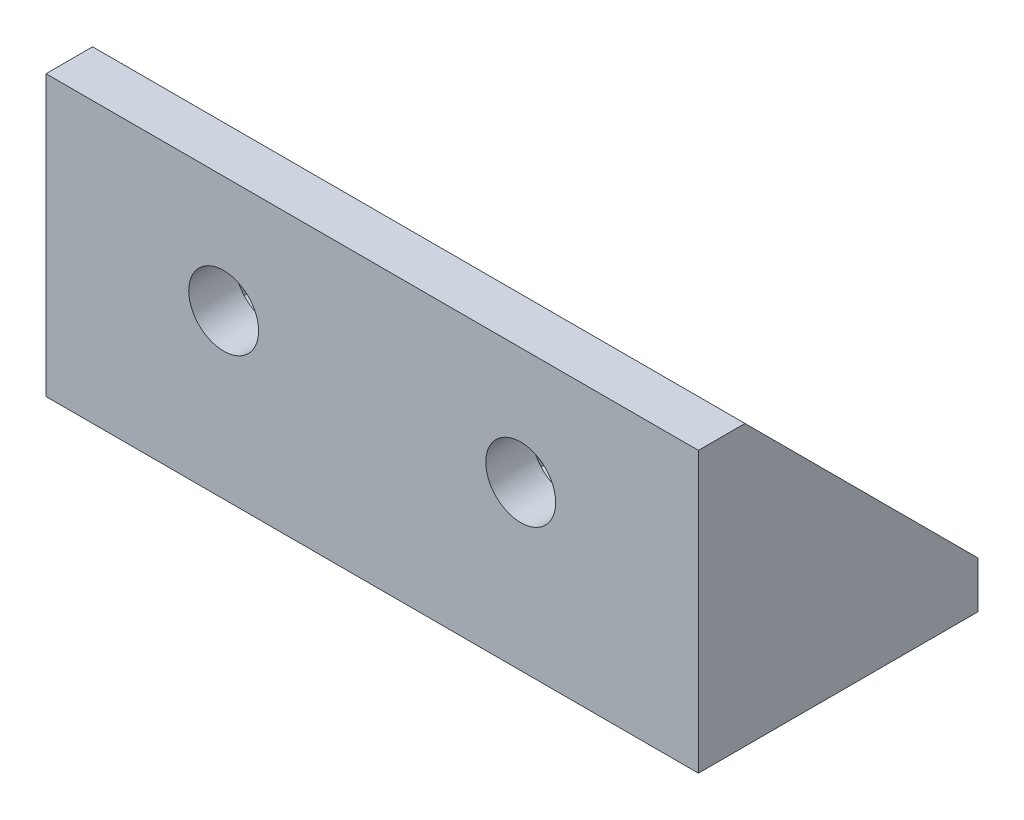
ISO-10303-21;
HEADER;
FILE_DESCRIPTION(('STEP AP214'),'2;1');
FILE_NAME('part.step','',(''),(''),'','','');
FILE_SCHEMA(('AUTOMOTIVE_DESIGN { 1 0 10303 214 1 1 1 1 }'));
ENDSEC;
DATA;
#1=APPLICATION_CONTEXT('core data for automotive mechanical design processes');
#2=APPLICATION_PROTOCOL_DEFINITION('international standard','automotive_design',2000,#1);
#3=PRODUCT_CONTEXT('',#1,'mechanical');
#4=PRODUCT('Part','Part','',(#3));
#5=PRODUCT_RELATED_PRODUCT_CATEGORY('part','',(#4));
#6=PRODUCT_DEFINITION_FORMATION('','',#4);
#7=PRODUCT_DEFINITION_CONTEXT('part definition',#1,'design');
#8=PRODUCT_DEFINITION('design','',#6,#7);
#9=PRODUCT_DEFINITION_SHAPE('','',#8);
#10=(LENGTH_UNIT() NAMED_UNIT(*) SI_UNIT(.MILLI.,.METRE.));
#11=(NAMED_UNIT(*) PLANE_ANGLE_UNIT() SI_UNIT($,.RADIAN.));
#12=(NAMED_UNIT(*) SI_UNIT($,.STERADIAN.) SOLID_ANGLE_UNIT());
#13=UNCERTAINTY_MEASURE_WITH_UNIT(LENGTH_MEASURE(1.E-05),#10,'distance_accuracy_value','');
#14=(GEOMETRIC_REPRESENTATION_CONTEXT(3) GLOBAL_UNCERTAINTY_ASSIGNED_CONTEXT((#13)) GLOBAL_UNIT_ASSIGNED_CONTEXT((#10,
#11,#12)) REPRESENTATION_CONTEXT('',''));
#15=CARTESIAN_POINT('',(0.,0.,0.));
#16=DIRECTION('',(0.,0.,1.));
#17=DIRECTION('',(1.,0.,0.));
#18=AXIS2_PLACEMENT_3D('',#15,#16,#17);
#19=CARTESIAN_POINT('',(53.,4.,-20.));
#20=DIRECTION('',(0.,0.707106781186548,-0.707106781186548));
#21=DIRECTION('',(0.,0.707106781186548,0.707106781186548));
#22=AXIS2_PLACEMENT_3D('',#19,#20,#21);
#23=PLANE('',#22);
#24=DIRECTION('',(0.,0.707106781186548,0.707106781186548));
#25=VECTOR('',#24,1.);
#26=CARTESIAN_POINT('',(27.5,4.,-20.));
#27=LINE('',#26,#25);
#28=CARTESIAN_POINT('',(27.5,4.,-20.));
#29=VERTEX_POINT('',#28);
#30=CARTESIAN_POINT('',(27.5,24.,0.));
#31=VERTEX_POINT('',#30);
#32=EDGE_CURVE('E11',#29,#31,#27,.T.);
#33=ORIENTED_EDGE('',*,*,#32,.F.);
#34=DIRECTION('',(-1.,0.,0.));
#35=VECTOR('',#34,1.);
#36=CARTESIAN_POINT('',(0.,4.,-20.));
#37=LINE('',#36,#35);
#38=CARTESIAN_POINT('',(22.5,4.,-20.));
#39=VERTEX_POINT('',#38);
#40=EDGE_CURVE('E304',#29,#39,#37,.T.);
#41=ORIENTED_EDGE('',*,*,#40,.T.);
#42=DIRECTION('',(0.,-0.707106781186548,-0.707106781186548));
#43=VECTOR('',#42,1.);
#44=CARTESIAN_POINT('',(22.5,4.,-20.));
#45=LINE('',#44,#43);
#46=CARTESIAN_POINT('',(22.5,24.,0.));
#47=VERTEX_POINT('',#46);
#48=EDGE_CURVE('E150',#47,#39,#45,.T.);
#49=ORIENTED_EDGE('',*,*,#48,.F.);
#50=DIRECTION('',(-1.,0.,0.));
#51=VECTOR('',#50,1.);
#52=CARTESIAN_POINT('',(0.,24.,0.));
#53=LINE('',#52,#51);
#54=EDGE_CURVE('E157',#31,#47,#53,.T.);
#55=ORIENTED_EDGE('',*,*,#54,.F.);
#56=EDGE_LOOP('',(#33,#41,#49,#55));
#57=FACE_BOUND('',#56,.T.);
#58=ADVANCED_FACE('F39',(#57),#23,.T.);
#59=DIRECTION('',(0.,-0.707106781186548,-0.707106781186548));
#60=VECTOR('',#59,1.);
#61=CARTESIAN_POINT('',(48.,4.,-20.));
#62=LINE('',#61,#60);
#63=CARTESIAN_POINT('',(48.,24.,0.));
#64=VERTEX_POINT('',#63);
#65=CARTESIAN_POINT('',(48.,4.,-20.));
#66=VERTEX_POINT('',#65);
#67=EDGE_CURVE('E48',#64,#66,#62,.T.);
#68=ORIENTED_EDGE('',*,*,#67,.F.);
#69=CARTESIAN_POINT('',(53.,24.,0.));
#70=VERTEX_POINT('',#69);
#71=EDGE_CURVE('E146',#70,#64,#53,.T.);
#72=ORIENTED_EDGE('',*,*,#71,.F.);
#73=DIRECTION('',(0.,-0.707106781186548,-0.707106781186548));
#74=VECTOR('',#73,1.);
#75=CARTESIAN_POINT('',(53.,4.,-20.));
#76=LINE('',#75,#74);
#77=CARTESIAN_POINT('',(53.,4.,-20.));
#78=VERTEX_POINT('',#77);
#79=EDGE_CURVE('E188',#70,#78,#76,.T.);
#80=ORIENTED_EDGE('',*,*,#79,.T.);
#81=EDGE_CURVE('E148',#78,#66,#37,.T.);
#82=ORIENTED_EDGE('',*,*,#81,.T.);
#83=EDGE_LOOP('',(#68,#72,#80,#82));
#84=FACE_BOUND('',#83,.T.);
#85=ADVANCED_FACE('F144',(#84),#23,.T.);
#86=DIRECTION('',(0.,0.707106781186548,0.707106781186548));
#87=VECTOR('',#86,1.);
#88=CARTESIAN_POINT('',(2.,4.,-20.));
#89=LINE('',#88,#87);
#90=CARTESIAN_POINT('',(2.,4.,-20.));
#91=VERTEX_POINT('',#90);
#92=CARTESIAN_POINT('',(2.,24.,0.));
#93=VERTEX_POINT('',#92);
#94=EDGE_CURVE('E294',#91,#93,#89,.T.);
#95=ORIENTED_EDGE('',*,*,#94,.F.);
#96=CARTESIAN_POINT('',(-3.,4.,-20.));
#97=VERTEX_POINT('',#96);
#98=EDGE_CURVE('E297',#91,#97,#37,.T.);
#99=ORIENTED_EDGE('',*,*,#98,.T.);
#100=DIRECTION('',(0.,-0.707106781186548,-0.707106781186548));
#101=VECTOR('',#100,1.);
#102=CARTESIAN_POINT('',(-3.,4.,-20.));
#103=LINE('',#102,#101);
#104=CARTESIAN_POINT('',(-3.,24.,0.));
#105=VERTEX_POINT('',#104);
#106=EDGE_CURVE('E206',#105,#97,#103,.T.);
#107=ORIENTED_EDGE('',*,*,#106,.F.);
#108=EDGE_CURVE('E159',#93,#105,#53,.T.);
#109=ORIENTED_EDGE('',*,*,#108,.F.);
#110=EDGE_LOOP('',(#95,#99,#107,#109));
#111=FACE_BOUND('',#110,.T.);
#112=ADVANCED_FACE('F295',(#111),#23,.T.);
#113=CARTESIAN_POINT('',(53.,0.,0.));
#114=DIRECTION('',(1.,0.,0.));
#115=DIRECTION('',(0.,0.,-1.));
#116=AXIS2_PLACEMENT_3D('',#113,#114,#115);
#117=PLANE('',#116);
#118=ORIENTED_EDGE('',*,*,#79,.F.);
#119=DIRECTION('',(0.,0.,-1.));
#120=VECTOR('',#119,1.);
#121=CARTESIAN_POINT('',(53.,24.,0.));
#122=LINE('',#121,#120);
#123=CARTESIAN_POINT('',(53.,24.,4.));
#124=VERTEX_POINT('',#123);
#125=EDGE_CURVE('E154',#124,#70,#122,.T.);
#126=ORIENTED_EDGE('',*,*,#125,.F.);
#127=DIRECTION('',(0.,1.,0.));
#128=VECTOR('',#127,1.);
#129=CARTESIAN_POINT('',(53.,24.,4.));
#130=LINE('',#129,#128);
#131=CARTESIAN_POINT('',(53.,0.,4.));
#132=VERTEX_POINT('',#131);
#133=EDGE_CURVE('E175',#132,#124,#130,.T.);
#134=ORIENTED_EDGE('',*,*,#133,.F.);
#135=DIRECTION('',(0.,0.,1.));
#136=VECTOR('',#135,1.);
#137=CARTESIAN_POINT('',(53.,0.,-20.));
#138=LINE('',#137,#136);
#139=CARTESIAN_POINT('',(53.,0.,-20.));
#140=VERTEX_POINT('',#139);
#141=EDGE_CURVE('E180',#140,#132,#138,.T.);
#142=ORIENTED_EDGE('',*,*,#141,.F.);
#143=DIRECTION('',(0.,-1.,0.));
#144=VECTOR('',#143,1.);
#145=CARTESIAN_POINT('',(53.,4.,-20.));
#146=LINE('',#145,#144);
#147=EDGE_CURVE('E184',#78,#140,#146,.T.);
#148=ORIENTED_EDGE('',*,*,#147,.F.);
#149=EDGE_LOOP('',(#118,#126,#134,#142,#148));
#150=FACE_BOUND('',#149,.T.);
#151=ADVANCED_FACE('F342',(#150),#117,.T.);
#152=CARTESIAN_POINT('',(-3.,0.,0.));
#153=DIRECTION('',(1.,0.,0.));
#154=DIRECTION('',(0.,0.,-1.));
#155=AXIS2_PLACEMENT_3D('',#152,#153,#154);
#156=PLANE('',#155);
#157=ORIENTED_EDGE('',*,*,#106,.T.);
#158=DIRECTION('',(0.,-1.,0.));
#159=VECTOR('',#158,1.);
#160=CARTESIAN_POINT('',(-3.,4.,-20.));
#161=LINE('',#160,#159);
#162=CARTESIAN_POINT('',(-3.,0.,-20.));
#163=VERTEX_POINT('',#162);
#164=EDGE_CURVE('E202',#97,#163,#161,.T.);
#165=ORIENTED_EDGE('',*,*,#164,.T.);
#166=DIRECTION('',(0.,0.,1.));
#167=VECTOR('',#166,1.);
#168=CARTESIAN_POINT('',(-3.,0.,-20.));
#169=LINE('',#168,#167);
#170=CARTESIAN_POINT('',(-3.,0.,4.));
#171=VERTEX_POINT('',#170);
#172=EDGE_CURVE('E198',#163,#171,#169,.T.);
#173=ORIENTED_EDGE('',*,*,#172,.T.);
#174=DIRECTION('',(0.,1.,0.));
#175=VECTOR('',#174,1.);
#176=CARTESIAN_POINT('',(-3.,24.,4.));
#177=LINE('',#176,#175);
#178=CARTESIAN_POINT('',(-3.,24.,4.));
#179=VERTEX_POINT('',#178);
#180=EDGE_CURVE('E194',#171,#179,#177,.T.);
#181=ORIENTED_EDGE('',*,*,#180,.T.);
#182=DIRECTION('',(0.,0.,-1.));
#183=VECTOR('',#182,1.);
#184=CARTESIAN_POINT('',(-3.,24.,0.));
#185=LINE('',#184,#183);
#186=EDGE_CURVE('E191',#179,#105,#185,.T.);
#187=ORIENTED_EDGE('',*,*,#186,.T.);
#188=EDGE_LOOP('',(#157,#165,#173,#181,#187));
#189=FACE_BOUND('',#188,.T.);
#190=ADVANCED_FACE('F346',(#189),#156,.F.);
#191=CARTESIAN_POINT('',(0.,0.,0.));
#192=DIRECTION('',(0.,1.,0.));
#193=DIRECTION('',(0.,0.,1.));
#194=AXIS2_PLACEMENT_3D('',#191,#192,#193);
#195=PLANE('',#194);
#196=CARTESIAN_POINT('',(12.25,0.,-10.));
#197=DIRECTION('',(0.,1.,0.));
#198=DIRECTION('',(0.,0.,1.));
#199=AXIS2_PLACEMENT_3D('',#196,#197,#198);
#200=CIRCLE('',#199,3.);
#201=CARTESIAN_POINT('',(12.25,0.,-7.));
#202=VERTEX_POINT('',#201);
#203=EDGE_CURVE('E258',#202,#202,#200,.T.);
#204=ORIENTED_EDGE('',*,*,#203,.T.);
#205=EDGE_LOOP('',(#204));
#206=FACE_BOUND('',#205,.T.);
#207=CARTESIAN_POINT('',(37.75,0.,-10.));
#208=DIRECTION('',(0.,1.,0.));
#209=DIRECTION('',(0.,0.,1.));
#210=AXIS2_PLACEMENT_3D('',#207,#208,#209);
#211=CIRCLE('',#210,3.);
#212=CARTESIAN_POINT('',(37.75,0.,-7.));
#213=VERTEX_POINT('',#212);
#214=EDGE_CURVE('E265',#213,#213,#211,.T.);
#215=ORIENTED_EDGE('',*,*,#214,.T.);
#216=EDGE_LOOP('',(#215));
#217=FACE_BOUND('',#216,.T.);
#218=DIRECTION('',(1.,0.,0.));
#219=VECTOR('',#218,1.);
#220=CARTESIAN_POINT('',(0.,0.,4.));
#221=LINE('',#220,#219);
#222=EDGE_CURVE('E156',#171,#132,#221,.T.);
#223=ORIENTED_EDGE('',*,*,#222,.F.);
#224=ORIENTED_EDGE('',*,*,#172,.F.);
#225=DIRECTION('',(-1.,0.,0.));
#226=VECTOR('',#225,1.);
#227=CARTESIAN_POINT('',(0.,0.,-20.));
#228=LINE('',#227,#226);
#229=EDGE_CURVE('E162',#140,#163,#228,.T.);
#230=ORIENTED_EDGE('',*,*,#229,.F.);
#231=ORIENTED_EDGE('',*,*,#141,.T.);
#232=EDGE_LOOP('',(#223,#224,#230,#231));
#233=FACE_BOUND('',#232,.T.);
#234=ADVANCED_FACE('F351',(#206,#217,#233),#195,.F.);
#235=CARTESIAN_POINT('',(0.,4.,4.));
#236=DIRECTION('',(0.,0.,-1.));
#237=DIRECTION('',(-1.,0.,0.));
#238=AXIS2_PLACEMENT_3D('',#235,#236,#237);
#239=PLANE('',#238);
#240=CARTESIAN_POINT('',(37.75,14.,4.));
#241=DIRECTION('',(0.,0.,-1.));
#242=DIRECTION('',(-1.,0.,0.));
#243=AXIS2_PLACEMENT_3D('',#240,#241,#242);
#244=CIRCLE('',#243,3.);
#245=CARTESIAN_POINT('',(34.75,14.,4.));
#246=VERTEX_POINT('',#245);
#247=EDGE_CURVE('E249',#246,#246,#244,.T.);
#248=ORIENTED_EDGE('',*,*,#247,.T.);
#249=EDGE_LOOP('',(#248));
#250=FACE_BOUND('',#249,.T.);
#251=CARTESIAN_POINT('',(12.25,14.,4.));
#252=DIRECTION('',(0.,0.,-1.));
#253=DIRECTION('',(-1.,0.,0.));
#254=AXIS2_PLACEMENT_3D('',#251,#252,#253);
#255=CIRCLE('',#254,3.);
#256=CARTESIAN_POINT('',(9.25,14.,4.));
#257=VERTEX_POINT('',#256);
#258=EDGE_CURVE('E224',#257,#257,#255,.T.);
#259=ORIENTED_EDGE('',*,*,#258,.T.);
#260=EDGE_LOOP('',(#259));
#261=FACE_BOUND('',#260,.T.);
#262=ORIENTED_EDGE('',*,*,#222,.T.);
#263=ORIENTED_EDGE('',*,*,#133,.T.);
#264=DIRECTION('',(1.,0.,0.));
#265=VECTOR('',#264,1.);
#266=CARTESIAN_POINT('',(0.,24.,4.));
#267=LINE('',#266,#265);
#268=EDGE_CURVE('E167',#179,#124,#267,.T.);
#269=ORIENTED_EDGE('',*,*,#268,.F.);
#270=ORIENTED_EDGE('',*,*,#180,.F.);
#271=EDGE_LOOP('',(#262,#263,#269,#270));
#272=FACE_BOUND('',#271,.T.);
#273=ADVANCED_FACE('F41',(#250,#261,#272),#239,.F.);
#274=CARTESIAN_POINT('',(0.,4.,-20.));
#275=DIRECTION('',(0.,0.,1.));
#276=DIRECTION('',(1.,0.,0.));
#277=AXIS2_PLACEMENT_3D('',#274,#275,#276);
#278=PLANE('',#277);
#279=ORIENTED_EDGE('',*,*,#229,.T.);
#280=ORIENTED_EDGE('',*,*,#164,.F.);
#281=ORIENTED_EDGE('',*,*,#98,.F.);
#282=DIRECTION('',(-1.,0.,0.));
#283=VECTOR('',#282,1.);
#284=CARTESIAN_POINT('',(22.5,4.,-20.));
#285=LINE('',#284,#283);
#286=EDGE_CURVE('E219',#39,#91,#285,.T.);
#287=ORIENTED_EDGE('',*,*,#286,.F.);
#288=ORIENTED_EDGE('',*,*,#40,.F.);
#289=DIRECTION('',(-1.,0.,0.));
#290=VECTOR('',#289,1.);
#291=CARTESIAN_POINT('',(48.,4.,-20.));
#292=LINE('',#291,#290);
#293=EDGE_CURVE('E140',#66,#29,#292,.T.);
#294=ORIENTED_EDGE('',*,*,#293,.F.);
#295=ORIENTED_EDGE('',*,*,#81,.F.);
#296=ORIENTED_EDGE('',*,*,#147,.T.);
#297=EDGE_LOOP('',(#279,#280,#281,#287,#288,#294,#295,#296));
#298=FACE_BOUND('',#297,.T.);
#299=ADVANCED_FACE('F302',(#298),#278,.F.);
#300=CARTESIAN_POINT('',(0.,24.,0.));
#301=DIRECTION('',(0.,-1.,0.));
#302=DIRECTION('',(0.,0.,-1.));
#303=AXIS2_PLACEMENT_3D('',#300,#301,#302);
#304=PLANE('',#303);
#305=ORIENTED_EDGE('',*,*,#71,.T.);
#306=DIRECTION('',(1.,0.,0.));
#307=VECTOR('',#306,1.);
#308=CARTESIAN_POINT('',(48.,24.,0.));
#309=LINE('',#308,#307);
#310=EDGE_CURVE('E132',#31,#64,#309,.T.);
#311=ORIENTED_EDGE('',*,*,#310,.F.);
#312=ORIENTED_EDGE('',*,*,#54,.T.);
#313=DIRECTION('',(1.,0.,0.));
#314=VECTOR('',#313,1.);
#315=CARTESIAN_POINT('',(22.5,24.,0.));
#316=LINE('',#315,#314);
#317=EDGE_CURVE('E228',#93,#47,#316,.T.);
#318=ORIENTED_EDGE('',*,*,#317,.F.);
#319=ORIENTED_EDGE('',*,*,#108,.T.);
#320=ORIENTED_EDGE('',*,*,#186,.F.);
#321=ORIENTED_EDGE('',*,*,#268,.T.);
#322=ORIENTED_EDGE('',*,*,#125,.T.);
#323=EDGE_LOOP('',(#305,#311,#312,#318,#319,#320,#321,#322));
#324=FACE_BOUND('',#323,.T.);
#325=ADVANCED_FACE('F152',(#324),#304,.F.);
#326=CARTESIAN_POINT('',(22.5,4.,0.));
#327=DIRECTION('',(0.,-1.,0.));
#328=DIRECTION('',(1.,0.,0.));
#329=AXIS2_PLACEMENT_3D('',#326,#327,#328);
#330=PLANE('',#329);
#331=CARTESIAN_POINT('',(12.25,3.99999999999999,-10.));
#332=DIRECTION('',(0.,1.,0.));
#333=DIRECTION('',(-1.,0.,0.));
#334=AXIS2_PLACEMENT_3D('',#331,#332,#333);
#335=CIRCLE('',#334,3.);
#336=CARTESIAN_POINT('',(9.25,3.99999999999999,-10.));
#337=VERTEX_POINT('',#336);
#338=EDGE_CURVE('E269',#337,#337,#335,.T.);
#339=ORIENTED_EDGE('',*,*,#338,.F.);
#340=EDGE_LOOP('',(#339));
#341=FACE_BOUND('',#340,.T.);
#342=ORIENTED_EDGE('',*,*,#286,.T.);
#343=DIRECTION('',(0.,0.,-1.));
#344=VECTOR('',#343,1.);
#345=CARTESIAN_POINT('',(2.,4.,0.));
#346=LINE('',#345,#344);
#347=CARTESIAN_POINT('',(2.,4.,0.));
#348=VERTEX_POINT('',#347);
#349=EDGE_CURVE('E211',#348,#91,#346,.T.);
#350=ORIENTED_EDGE('',*,*,#349,.F.);
#351=DIRECTION('',(-1.,0.,0.));
#352=VECTOR('',#351,1.);
#353=CARTESIAN_POINT('',(22.5,4.,0.));
#354=LINE('',#353,#352);
#355=CARTESIAN_POINT('',(22.5,4.,0.));
#356=VERTEX_POINT('',#355);
#357=EDGE_CURVE('E223',#356,#348,#354,.T.);
#358=ORIENTED_EDGE('',*,*,#357,.F.);
#359=DIRECTION('',(0.,0.,-1.));
#360=VECTOR('',#359,1.);
#361=CARTESIAN_POINT('',(22.5,4.,0.));
#362=LINE('',#361,#360);
#363=EDGE_CURVE('E214',#356,#39,#362,.T.);
#364=ORIENTED_EDGE('',*,*,#363,.T.);
#365=EDGE_LOOP('',(#342,#350,#358,#364));
#366=FACE_BOUND('',#365,.T.);
#367=ADVANCED_FACE('F281',(#341,#366),#330,.F.);
#368=CARTESIAN_POINT('',(22.5,24.,0.));
#369=DIRECTION('',(1.,0.,0.));
#370=DIRECTION('',(0.,0.,-1.));
#371=AXIS2_PLACEMENT_3D('',#368,#369,#370);
#372=PLANE('',#371);
#373=ORIENTED_EDGE('',*,*,#48,.T.);
#374=ORIENTED_EDGE('',*,*,#363,.F.);
#375=DIRECTION('',(0.,-1.,0.));
#376=VECTOR('',#375,1.);
#377=CARTESIAN_POINT('',(22.5,24.,0.));
#378=LINE('',#377,#376);
#379=EDGE_CURVE('E215',#47,#356,#378,.T.);
#380=ORIENTED_EDGE('',*,*,#379,.F.);
#381=EDGE_LOOP('',(#373,#374,#380));
#382=FACE_BOUND('',#381,.T.);
#383=ADVANCED_FACE('F284',(#382),#372,.F.);
#384=CARTESIAN_POINT('',(2.,4.,0.));
#385=DIRECTION('',(-1.,0.,0.));
#386=DIRECTION('',(0.,0.,1.));
#387=AXIS2_PLACEMENT_3D('',#384,#385,#386);
#388=PLANE('',#387);
#389=ORIENTED_EDGE('',*,*,#94,.T.);
#390=DIRECTION('',(0.,1.,0.));
#391=VECTOR('',#390,1.);
#392=CARTESIAN_POINT('',(2.,4.,0.));
#393=LINE('',#392,#391);
#394=EDGE_CURVE('E55',#348,#93,#393,.T.);
#395=ORIENTED_EDGE('',*,*,#394,.F.);
#396=ORIENTED_EDGE('',*,*,#349,.T.);
#397=EDGE_LOOP('',(#389,#395,#396));
#398=FACE_BOUND('',#397,.T.);
#399=ADVANCED_FACE('F320',(#398),#388,.F.);
#400=CARTESIAN_POINT('',(0.,0.,0.));
#401=DIRECTION('',(0.,0.,-1.));
#402=DIRECTION('',(-1.,0.,0.));
#403=AXIS2_PLACEMENT_3D('',#400,#401,#402);
#404=PLANE('',#403);
#405=CARTESIAN_POINT('',(12.25,14.,0.));
#406=DIRECTION('',(0.,0.,-1.));
#407=DIRECTION('',(1.,0.,0.));
#408=AXIS2_PLACEMENT_3D('',#405,#406,#407);
#409=CIRCLE('',#408,3.);
#410=CARTESIAN_POINT('',(15.25,14.,0.));
#411=VERTEX_POINT('',#410);
#412=EDGE_CURVE('E254',#411,#411,#409,.T.);
#413=ORIENTED_EDGE('',*,*,#412,.F.);
#414=EDGE_LOOP('',(#413));
#415=FACE_BOUND('',#414,.T.);
#416=ORIENTED_EDGE('',*,*,#357,.T.);
#417=ORIENTED_EDGE('',*,*,#394,.T.);
#418=ORIENTED_EDGE('',*,*,#317,.T.);
#419=ORIENTED_EDGE('',*,*,#379,.T.);
#420=EDGE_LOOP('',(#416,#417,#418,#419));
#421=FACE_BOUND('',#420,.T.);
#422=ADVANCED_FACE('F317',(#415,#421),#404,.T.);
#423=CARTESIAN_POINT('',(27.5,4.,0.));
#424=DIRECTION('',(-1.,0.,0.));
#425=DIRECTION('',(0.,0.,1.));
#426=AXIS2_PLACEMENT_3D('',#423,#424,#425);
#427=PLANE('',#426);
#428=ORIENTED_EDGE('',*,*,#32,.T.);
#429=DIRECTION('',(0.,1.,0.));
#430=VECTOR('',#429,1.);
#431=CARTESIAN_POINT('',(27.5,4.,0.));
#432=LINE('',#431,#430);
#433=CARTESIAN_POINT('',(27.5,4.,0.));
#434=VERTEX_POINT('',#433);
#435=EDGE_CURVE('E63',#434,#31,#432,.T.);
#436=ORIENTED_EDGE('',*,*,#435,.F.);
#437=DIRECTION('',(0.,0.,-1.));
#438=VECTOR('',#437,1.);
#439=CARTESIAN_POINT('',(27.5,4.,0.));
#440=LINE('',#439,#438);
#441=EDGE_CURVE('E210',#434,#29,#440,.T.);
#442=ORIENTED_EDGE('',*,*,#441,.T.);
#443=EDGE_LOOP('',(#428,#436,#442));
#444=FACE_BOUND('',#443,.T.);
#445=ADVANCED_FACE('F319',(#444),#427,.F.);
#446=CARTESIAN_POINT('',(48.,4.,0.));
#447=DIRECTION('',(0.,-1.,0.));
#448=DIRECTION('',(1.,0.,0.));
#449=AXIS2_PLACEMENT_3D('',#446,#447,#448);
#450=PLANE('',#449);
#451=CARTESIAN_POINT('',(37.75,4.,-10.));
#452=DIRECTION('',(0.,1.,0.));
#453=DIRECTION('',(1.,0.,0.));
#454=AXIS2_PLACEMENT_3D('',#451,#452,#453);
#455=CIRCLE('',#454,3.);
#456=CARTESIAN_POINT('',(40.75,4.,-10.));
#457=VERTEX_POINT('',#456);
#458=EDGE_CURVE('E270',#457,#457,#455,.T.);
#459=ORIENTED_EDGE('',*,*,#458,.F.);
#460=EDGE_LOOP('',(#459));
#461=FACE_BOUND('',#460,.T.);
#462=ORIENTED_EDGE('',*,*,#293,.T.);
#463=ORIENTED_EDGE('',*,*,#441,.F.);
#464=DIRECTION('',(-1.,0.,0.));
#465=VECTOR('',#464,1.);
#466=CARTESIAN_POINT('',(48.,4.,0.));
#467=LINE('',#466,#465);
#468=CARTESIAN_POINT('',(48.,4.,0.));
#469=VERTEX_POINT('',#468);
#470=EDGE_CURVE('E131',#469,#434,#467,.T.);
#471=ORIENTED_EDGE('',*,*,#470,.F.);
#472=DIRECTION('',(0.,0.,-1.));
#473=VECTOR('',#472,1.);
#474=CARTESIAN_POINT('',(48.,4.,0.));
#475=LINE('',#474,#473);
#476=EDGE_CURVE('E128',#469,#66,#475,.T.);
#477=ORIENTED_EDGE('',*,*,#476,.T.);
#478=EDGE_LOOP('',(#462,#463,#471,#477));
#479=FACE_BOUND('',#478,.T.);
#480=ADVANCED_FACE('F327',(#461,#479),#450,.F.);
#481=CARTESIAN_POINT('',(48.,24.,0.));
#482=DIRECTION('',(1.,0.,0.));
#483=DIRECTION('',(0.,0.,-1.));
#484=AXIS2_PLACEMENT_3D('',#481,#482,#483);
#485=PLANE('',#484);
#486=ORIENTED_EDGE('',*,*,#67,.T.);
#487=ORIENTED_EDGE('',*,*,#476,.F.);
#488=DIRECTION('',(0.,-1.,0.));
#489=VECTOR('',#488,1.);
#490=CARTESIAN_POINT('',(48.,24.,0.));
#491=LINE('',#490,#489);
#492=EDGE_CURVE('E124',#64,#469,#491,.T.);
#493=ORIENTED_EDGE('',*,*,#492,.F.);
#494=EDGE_LOOP('',(#486,#487,#493));
#495=FACE_BOUND('',#494,.T.);
#496=ADVANCED_FACE('F125',(#495),#485,.F.);
#497=CARTESIAN_POINT('',(0.,0.,0.));
#498=DIRECTION('',(0.,0.,-1.));
#499=DIRECTION('',(-1.,0.,0.));
#500=AXIS2_PLACEMENT_3D('',#497,#498,#499);
#501=PLANE('',#500);
#502=CARTESIAN_POINT('',(37.75,14.,0.));
#503=DIRECTION('',(0.,0.,-1.));
#504=DIRECTION('',(-1.,0.,0.));
#505=AXIS2_PLACEMENT_3D('',#502,#503,#504);
#506=CIRCLE('',#505,3.);
#507=CARTESIAN_POINT('',(34.75,14.,0.));
#508=VERTEX_POINT('',#507);
#509=EDGE_CURVE('E253',#508,#508,#506,.T.);
#510=ORIENTED_EDGE('',*,*,#509,.F.);
#511=EDGE_LOOP('',(#510));
#512=FACE_BOUND('',#511,.T.);
#513=ORIENTED_EDGE('',*,*,#310,.T.);
#514=ORIENTED_EDGE('',*,*,#492,.T.);
#515=ORIENTED_EDGE('',*,*,#470,.T.);
#516=ORIENTED_EDGE('',*,*,#435,.T.);
#517=EDGE_LOOP('',(#513,#514,#515,#516));
#518=FACE_BOUND('',#517,.T.);
#519=ADVANCED_FACE('F135',(#512,#518),#501,.T.);
#520=CARTESIAN_POINT('',(37.75,14.,17.));
#521=DIRECTION('',(0.,0.,-1.));
#522=DIRECTION('',(-1.,0.,0.));
#523=AXIS2_PLACEMENT_3D('',#520,#521,#522);
#524=CYLINDRICAL_SURFACE('',#523,3.);
#525=ORIENTED_EDGE('',*,*,#509,.T.);
#526=EDGE_LOOP('',(#525));
#527=FACE_BOUND('',#526,.T.);
#528=ORIENTED_EDGE('',*,*,#247,.F.);
#529=EDGE_LOOP('',(#528));
#530=FACE_BOUND('',#529,.T.);
#531=ADVANCED_FACE('F406',(#527,#530),#524,.F.);
#532=CARTESIAN_POINT('',(12.25,14.,17.));
#533=DIRECTION('',(0.,0.,-1.));
#534=DIRECTION('',(-1.,0.,0.));
#535=AXIS2_PLACEMENT_3D('',#532,#533,#534);
#536=CYLINDRICAL_SURFACE('',#535,3.);
#537=ORIENTED_EDGE('',*,*,#412,.T.);
#538=EDGE_LOOP('',(#537));
#539=FACE_BOUND('',#538,.T.);
#540=ORIENTED_EDGE('',*,*,#258,.F.);
#541=EDGE_LOOP('',(#540));
#542=FACE_BOUND('',#541,.T.);
#543=ADVANCED_FACE('F416',(#539,#542),#536,.F.);
#544=CARTESIAN_POINT('',(37.75,-16.,-10.));
#545=DIRECTION('',(0.,1.,0.));
#546=DIRECTION('',(-1.,0.,0.));
#547=AXIS2_PLACEMENT_3D('',#544,#545,#546);
#548=CYLINDRICAL_SURFACE('',#547,3.);
#549=ORIENTED_EDGE('',*,*,#458,.T.);
#550=EDGE_LOOP('',(#549));
#551=FACE_BOUND('',#550,.T.);
#552=ORIENTED_EDGE('',*,*,#214,.F.);
#553=EDGE_LOOP('',(#552));
#554=FACE_BOUND('',#553,.T.);
#555=ADVANCED_FACE('F426',(#551,#554),#548,.F.);
#556=CARTESIAN_POINT('',(12.25,-16.,-10.));
#557=DIRECTION('',(0.,1.,0.));
#558=DIRECTION('',(-1.,0.,0.));
#559=AXIS2_PLACEMENT_3D('',#556,#557,#558);
#560=CYLINDRICAL_SURFACE('',#559,3.);
#561=ORIENTED_EDGE('',*,*,#338,.T.);
#562=EDGE_LOOP('',(#561));
#563=FACE_BOUND('',#562,.T.);
#564=ORIENTED_EDGE('',*,*,#203,.F.);
#565=EDGE_LOOP('',(#564));
#566=FACE_BOUND('',#565,.T.);
#567=ADVANCED_FACE('F278',(#563,#566),#560,.F.);
#568=CLOSED_SHELL('',(#58,#85,#112,#151,#190,#234,#273,#299,#325,#367,#383,#399,#422,#445,#480,
#496,#519,#531,#543,#555,#567));
#569=MANIFOLD_SOLID_BREP('B2',#568);
#570=ADVANCED_BREP_SHAPE_REPRESENTATION('',(#18,#569),#14);
#571=SHAPE_DEFINITION_REPRESENTATION(#9,#570);
ENDSEC;
END-ISO-10303-21;
